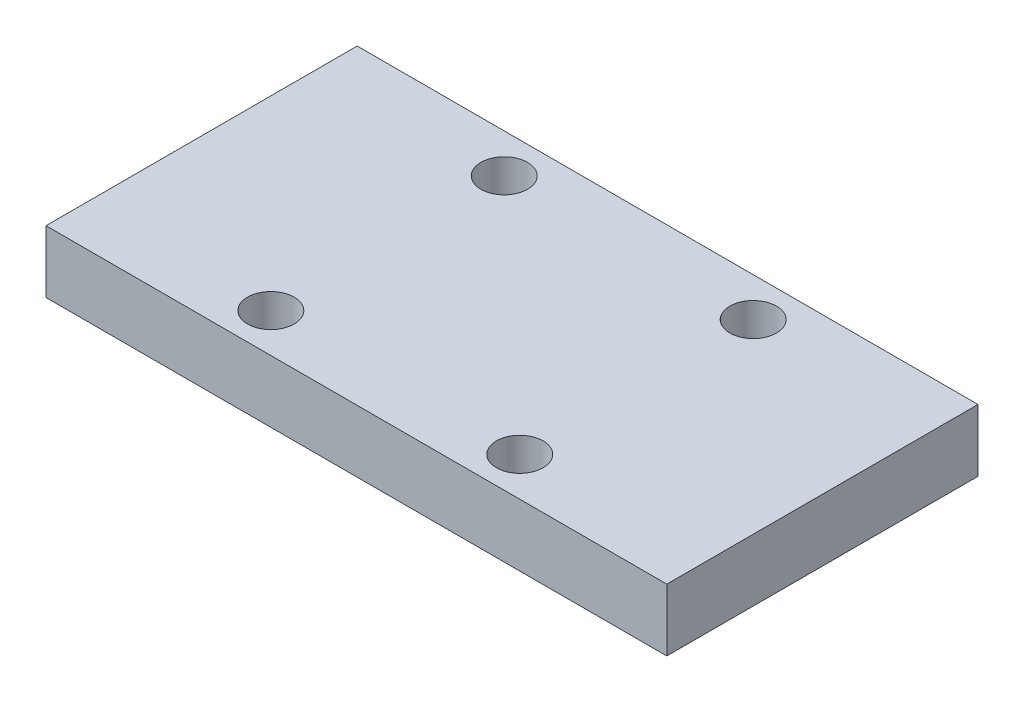
ISO-10303-21;
HEADER;
FILE_DESCRIPTION(('STEP AP214'),'2;1');
FILE_NAME('part.step','',(''),(''),'','','');
FILE_SCHEMA(('AUTOMOTIVE_DESIGN { 1 0 10303 214 1 1 1 1 }'));
ENDSEC;
DATA;
#1=APPLICATION_CONTEXT('core data for automotive mechanical design processes');
#2=APPLICATION_PROTOCOL_DEFINITION('international standard','automotive_design',2000,#1);
#3=PRODUCT_CONTEXT('',#1,'mechanical');
#4=PRODUCT('Part','Part','',(#3));
#5=PRODUCT_RELATED_PRODUCT_CATEGORY('part','',(#4));
#6=PRODUCT_DEFINITION_FORMATION('','',#4);
#7=PRODUCT_DEFINITION_CONTEXT('part definition',#1,'design');
#8=PRODUCT_DEFINITION('design','',#6,#7);
#9=PRODUCT_DEFINITION_SHAPE('','',#8);
#10=(LENGTH_UNIT() NAMED_UNIT(*) SI_UNIT(.MILLI.,.METRE.));
#11=(NAMED_UNIT(*) PLANE_ANGLE_UNIT() SI_UNIT($,.RADIAN.));
#12=(NAMED_UNIT(*) SI_UNIT($,.STERADIAN.) SOLID_ANGLE_UNIT());
#13=UNCERTAINTY_MEASURE_WITH_UNIT(LENGTH_MEASURE(1.E-05),#10,'distance_accuracy_value','');
#14=(GEOMETRIC_REPRESENTATION_CONTEXT(3) GLOBAL_UNCERTAINTY_ASSIGNED_CONTEXT((#13)) GLOBAL_UNIT_ASSIGNED_CONTEXT((#10,
#11,#12)) REPRESENTATION_CONTEXT('',''));
#15=CARTESIAN_POINT('',(0.,0.,0.));
#16=DIRECTION('',(0.,0.,1.));
#17=DIRECTION('',(1.,0.,0.));
#18=AXIS2_PLACEMENT_3D('',#15,#16,#17);
#19=CARTESIAN_POINT('',(0.,4.,0.));
#20=DIRECTION('',(0.,-1.,0.));
#21=DIRECTION('',(0.,0.,-1.));
#22=AXIS2_PLACEMENT_3D('',#19,#20,#21);
#23=PLANE('',#22);
#24=DIRECTION('',(0.,0.,-1.));
#25=VECTOR('',#24,1.);
#26=CARTESIAN_POINT('',(19.95,4.,10.));
#27=LINE('',#26,#25);
#28=CARTESIAN_POINT('',(19.95,4.,10.));
#29=VERTEX_POINT('',#28);
#30=CARTESIAN_POINT('',(19.95,4.,-10.));
#31=VERTEX_POINT('',#30);
#32=EDGE_CURVE('E96',#29,#31,#27,.T.);
#33=ORIENTED_EDGE('',*,*,#32,.T.);
#34=DIRECTION('',(-1.,0.,0.));
#35=VECTOR('',#34,1.);
#36=CARTESIAN_POINT('',(-19.95,4.,-10.));
#37=LINE('',#36,#35);
#38=CARTESIAN_POINT('',(-19.95,4.,-10.));
#39=VERTEX_POINT('',#38);
#40=EDGE_CURVE('E91',#31,#39,#37,.T.);
#41=ORIENTED_EDGE('',*,*,#40,.T.);
#42=DIRECTION('',(0.,0.,1.));
#43=VECTOR('',#42,1.);
#44=CARTESIAN_POINT('',(-19.95,4.,10.));
#45=LINE('',#44,#43);
#46=CARTESIAN_POINT('',(-19.95,4.,10.));
#47=VERTEX_POINT('',#46);
#48=EDGE_CURVE('E94',#39,#47,#45,.T.);
#49=ORIENTED_EDGE('',*,*,#48,.T.);
#50=DIRECTION('',(1.,0.,0.));
#51=VECTOR('',#50,1.);
#52=CARTESIAN_POINT('',(-19.95,4.,10.));
#53=LINE('',#52,#51);
#54=EDGE_CURVE('E61',#47,#29,#53,.T.);
#55=ORIENTED_EDGE('',*,*,#54,.T.);
#56=EDGE_LOOP('',(#33,#41,#49,#55));
#57=FACE_BOUND('',#56,.T.);
#58=CARTESIAN_POINT('',(8.,4.,-7.5));
#59=DIRECTION('',(0.,1.,0.));
#60=DIRECTION('',(0.,0.,1.));
#61=AXIS2_PLACEMENT_3D('',#58,#59,#60);
#62=CIRCLE('',#61,1.5);
#63=CARTESIAN_POINT('',(8.,4.,-6.));
#64=VERTEX_POINT('',#63);
#65=EDGE_CURVE('E116',#64,#64,#62,.T.);
#66=ORIENTED_EDGE('',*,*,#65,.F.);
#67=EDGE_LOOP('',(#66));
#68=FACE_BOUND('',#67,.T.);
#69=CARTESIAN_POINT('',(8.,4.,7.5));
#70=DIRECTION('',(0.,1.,0.));
#71=DIRECTION('',(0.,0.,-1.));
#72=AXIS2_PLACEMENT_3D('',#69,#70,#71);
#73=CIRCLE('',#72,1.5);
#74=CARTESIAN_POINT('',(8.,4.,6.));
#75=VERTEX_POINT('',#74);
#76=EDGE_CURVE('E138',#75,#75,#73,.T.);
#77=ORIENTED_EDGE('',*,*,#76,.F.);
#78=EDGE_LOOP('',(#77));
#79=FACE_BOUND('',#78,.T.);
#80=CARTESIAN_POINT('',(-8.,4.,7.5));
#81=DIRECTION('',(0.,1.,0.));
#82=DIRECTION('',(0.,0.,1.));
#83=AXIS2_PLACEMENT_3D('',#80,#81,#82);
#84=CIRCLE('',#83,1.5);
#85=CARTESIAN_POINT('',(-8.,4.,9.));
#86=VERTEX_POINT('',#85);
#87=EDGE_CURVE('E146',#86,#86,#84,.T.);
#88=ORIENTED_EDGE('',*,*,#87,.F.);
#89=EDGE_LOOP('',(#88));
#90=FACE_BOUND('',#89,.T.);
#91=CARTESIAN_POINT('',(-8.,4.,-7.5));
#92=DIRECTION('',(0.,1.,0.));
#93=DIRECTION('',(0.,0.,-1.));
#94=AXIS2_PLACEMENT_3D('',#91,#92,#93);
#95=CIRCLE('',#94,1.5);
#96=CARTESIAN_POINT('',(-8.,4.,-9.));
#97=VERTEX_POINT('',#96);
#98=EDGE_CURVE('E154',#97,#97,#95,.T.);
#99=ORIENTED_EDGE('',*,*,#98,.F.);
#100=EDGE_LOOP('',(#99));
#101=FACE_BOUND('',#100,.T.);
#102=ADVANCED_FACE('F43',(#57,#68,#79,#90,#101),#23,.F.);
#103=CARTESIAN_POINT('',(0.,0.,0.));
#104=DIRECTION('',(0.,-1.,0.));
#105=DIRECTION('',(0.,0.,-1.));
#106=AXIS2_PLACEMENT_3D('',#103,#104,#105);
#107=PLANE('',#106);
#108=CARTESIAN_POINT('',(-8.,0.,7.5));
#109=DIRECTION('',(0.,1.,0.));
#110=DIRECTION('',(0.,0.,1.));
#111=AXIS2_PLACEMENT_3D('',#108,#109,#110);
#112=CIRCLE('',#111,1.5);
#113=CARTESIAN_POINT('',(-8.,0.,9.));
#114=VERTEX_POINT('',#113);
#115=EDGE_CURVE('E150',#114,#114,#112,.T.);
#116=ORIENTED_EDGE('',*,*,#115,.T.);
#117=EDGE_LOOP('',(#116));
#118=FACE_BOUND('',#117,.T.);
#119=CARTESIAN_POINT('',(8.,0.,-7.5));
#120=DIRECTION('',(0.,1.,0.));
#121=DIRECTION('',(0.,0.,1.));
#122=AXIS2_PLACEMENT_3D('',#119,#120,#121);
#123=CIRCLE('',#122,1.5);
#124=CARTESIAN_POINT('',(8.,0.,-6.));
#125=VERTEX_POINT('',#124);
#126=EDGE_CURVE('E134',#125,#125,#123,.T.);
#127=ORIENTED_EDGE('',*,*,#126,.T.);
#128=EDGE_LOOP('',(#127));
#129=FACE_BOUND('',#128,.T.);
#130=DIRECTION('',(0.,0.,-1.));
#131=VECTOR('',#130,1.);
#132=CARTESIAN_POINT('',(19.95,0.,10.));
#133=LINE('',#132,#131);
#134=CARTESIAN_POINT('',(19.95,0.,10.));
#135=VERTEX_POINT('',#134);
#136=CARTESIAN_POINT('',(19.95,0.,-10.));
#137=VERTEX_POINT('',#136);
#138=EDGE_CURVE('E112',#135,#137,#133,.T.);
#139=ORIENTED_EDGE('',*,*,#138,.F.);
#140=DIRECTION('',(1.,0.,0.));
#141=VECTOR('',#140,1.);
#142=CARTESIAN_POINT('',(-19.95,0.,10.));
#143=LINE('',#142,#141);
#144=CARTESIAN_POINT('',(-19.95,0.,10.));
#145=VERTEX_POINT('',#144);
#146=EDGE_CURVE('E84',#145,#135,#143,.T.);
#147=ORIENTED_EDGE('',*,*,#146,.F.);
#148=DIRECTION('',(0.,0.,1.));
#149=VECTOR('',#148,1.);
#150=CARTESIAN_POINT('',(-19.95,0.,10.));
#151=LINE('',#150,#149);
#152=CARTESIAN_POINT('',(-19.95,0.,-10.));
#153=VERTEX_POINT('',#152);
#154=EDGE_CURVE('E78',#153,#145,#151,.T.);
#155=ORIENTED_EDGE('',*,*,#154,.F.);
#156=DIRECTION('',(-1.,0.,0.));
#157=VECTOR('',#156,1.);
#158=CARTESIAN_POINT('',(-19.95,0.,-10.));
#159=LINE('',#158,#157);
#160=EDGE_CURVE('E101',#137,#153,#159,.T.);
#161=ORIENTED_EDGE('',*,*,#160,.F.);
#162=EDGE_LOOP('',(#139,#147,#155,#161));
#163=FACE_BOUND('',#162,.T.);
#164=CARTESIAN_POINT('',(8.,0.,7.5));
#165=DIRECTION('',(0.,1.,0.));
#166=DIRECTION('',(0.,0.,-1.));
#167=AXIS2_PLACEMENT_3D('',#164,#165,#166);
#168=CIRCLE('',#167,1.5);
#169=CARTESIAN_POINT('',(8.,0.,6.));
#170=VERTEX_POINT('',#169);
#171=EDGE_CURVE('E142',#170,#170,#168,.T.);
#172=ORIENTED_EDGE('',*,*,#171,.T.);
#173=EDGE_LOOP('',(#172));
#174=FACE_BOUND('',#173,.T.);
#175=CARTESIAN_POINT('',(-8.,0.,-7.5));
#176=DIRECTION('',(0.,1.,0.));
#177=DIRECTION('',(0.,0.,-1.));
#178=AXIS2_PLACEMENT_3D('',#175,#176,#177);
#179=CIRCLE('',#178,1.5);
#180=CARTESIAN_POINT('',(-8.,0.,-9.));
#181=VERTEX_POINT('',#180);
#182=EDGE_CURVE('E158',#181,#181,#179,.T.);
#183=ORIENTED_EDGE('',*,*,#182,.T.);
#184=EDGE_LOOP('',(#183));
#185=FACE_BOUND('',#184,.T.);
#186=ADVANCED_FACE('F129',(#118,#129,#163,#174,#185),#107,.T.);
#187=CARTESIAN_POINT('',(19.95,4.,10.));
#188=DIRECTION('',(-1.,0.,0.));
#189=DIRECTION('',(0.,0.,1.));
#190=AXIS2_PLACEMENT_3D('',#187,#188,#189);
#191=PLANE('',#190);
#192=ORIENTED_EDGE('',*,*,#138,.T.);
#193=DIRECTION('',(0.,-1.,0.));
#194=VECTOR('',#193,1.);
#195=CARTESIAN_POINT('',(19.95,4.,-10.));
#196=LINE('',#195,#194);
#197=EDGE_CURVE('E11',#31,#137,#196,.T.);
#198=ORIENTED_EDGE('',*,*,#197,.F.);
#199=ORIENTED_EDGE('',*,*,#32,.F.);
#200=DIRECTION('',(0.,-1.,0.));
#201=VECTOR('',#200,1.);
#202=CARTESIAN_POINT('',(19.95,4.,10.));
#203=LINE('',#202,#201);
#204=EDGE_CURVE('E108',#29,#135,#203,.T.);
#205=ORIENTED_EDGE('',*,*,#204,.T.);
#206=EDGE_LOOP('',(#192,#198,#199,#205));
#207=FACE_BOUND('',#206,.T.);
#208=ADVANCED_FACE('F45',(#207),#191,.F.);
#209=CARTESIAN_POINT('',(-19.95,4.,-10.));
#210=DIRECTION('',(0.,0.,1.));
#211=DIRECTION('',(1.,0.,0.));
#212=AXIS2_PLACEMENT_3D('',#209,#210,#211);
#213=PLANE('',#212);
#214=ORIENTED_EDGE('',*,*,#160,.T.);
#215=DIRECTION('',(0.,-1.,0.));
#216=VECTOR('',#215,1.);
#217=CARTESIAN_POINT('',(-19.95,4.,-10.));
#218=LINE('',#217,#216);
#219=EDGE_CURVE('E53',#39,#153,#218,.T.);
#220=ORIENTED_EDGE('',*,*,#219,.F.);
#221=ORIENTED_EDGE('',*,*,#40,.F.);
#222=ORIENTED_EDGE('',*,*,#197,.T.);
#223=EDGE_LOOP('',(#214,#220,#221,#222));
#224=FACE_BOUND('',#223,.T.);
#225=ADVANCED_FACE('F100',(#224),#213,.F.);
#226=CARTESIAN_POINT('',(-19.95,4.,10.));
#227=DIRECTION('',(1.,0.,0.));
#228=DIRECTION('',(0.,0.,-1.));
#229=AXIS2_PLACEMENT_3D('',#226,#227,#228);
#230=PLANE('',#229);
#231=ORIENTED_EDGE('',*,*,#154,.T.);
#232=DIRECTION('',(0.,-1.,0.));
#233=VECTOR('',#232,1.);
#234=CARTESIAN_POINT('',(-19.95,4.,10.));
#235=LINE('',#234,#233);
#236=EDGE_CURVE('E103',#47,#145,#235,.T.);
#237=ORIENTED_EDGE('',*,*,#236,.F.);
#238=ORIENTED_EDGE('',*,*,#48,.F.);
#239=ORIENTED_EDGE('',*,*,#219,.T.);
#240=EDGE_LOOP('',(#231,#237,#238,#239));
#241=FACE_BOUND('',#240,.T.);
#242=ADVANCED_FACE('F104',(#241),#230,.F.);
#243=CARTESIAN_POINT('',(-19.95,4.,10.));
#244=DIRECTION('',(0.,0.,-1.));
#245=DIRECTION('',(-1.,0.,0.));
#246=AXIS2_PLACEMENT_3D('',#243,#244,#245);
#247=PLANE('',#246);
#248=ORIENTED_EDGE('',*,*,#146,.T.);
#249=ORIENTED_EDGE('',*,*,#204,.F.);
#250=ORIENTED_EDGE('',*,*,#54,.F.);
#251=ORIENTED_EDGE('',*,*,#236,.T.);
#252=EDGE_LOOP('',(#248,#249,#250,#251));
#253=FACE_BOUND('',#252,.T.);
#254=ADVANCED_FACE('F126',(#253),#247,.F.);
#255=CARTESIAN_POINT('',(8.,4.,-7.5));
#256=DIRECTION('',(0.,-1.,0.));
#257=DIRECTION('',(0.,0.,-1.));
#258=AXIS2_PLACEMENT_3D('',#255,#256,#257);
#259=CYLINDRICAL_SURFACE('',#258,1.5);
#260=ORIENTED_EDGE('',*,*,#65,.T.);
#261=EDGE_LOOP('',(#260));
#262=FACE_BOUND('',#261,.T.);
#263=ORIENTED_EDGE('',*,*,#126,.F.);
#264=EDGE_LOOP('',(#263));
#265=FACE_BOUND('',#264,.T.);
#266=ADVANCED_FACE('F177',(#262,#265),#259,.F.);
#267=CARTESIAN_POINT('',(8.,4.,7.5));
#268=DIRECTION('',(0.,-1.,0.));
#269=DIRECTION('',(0.,0.,-1.));
#270=AXIS2_PLACEMENT_3D('',#267,#268,#269);
#271=CYLINDRICAL_SURFACE('',#270,1.5);
#272=ORIENTED_EDGE('',*,*,#76,.T.);
#273=EDGE_LOOP('',(#272));
#274=FACE_BOUND('',#273,.T.);
#275=ORIENTED_EDGE('',*,*,#171,.F.);
#276=EDGE_LOOP('',(#275));
#277=FACE_BOUND('',#276,.T.);
#278=ADVANCED_FACE('F231',(#274,#277),#271,.F.);
#279=CARTESIAN_POINT('',(-8.,4.,7.5));
#280=DIRECTION('',(0.,-1.,0.));
#281=DIRECTION('',(0.,0.,-1.));
#282=AXIS2_PLACEMENT_3D('',#279,#280,#281);
#283=CYLINDRICAL_SURFACE('',#282,1.5);
#284=ORIENTED_EDGE('',*,*,#87,.T.);
#285=EDGE_LOOP('',(#284));
#286=FACE_BOUND('',#285,.T.);
#287=ORIENTED_EDGE('',*,*,#115,.F.);
#288=EDGE_LOOP('',(#287));
#289=FACE_BOUND('',#288,.T.);
#290=ADVANCED_FACE('F240',(#286,#289),#283,.F.);
#291=CARTESIAN_POINT('',(-8.,4.,-7.5));
#292=DIRECTION('',(0.,-1.,0.));
#293=DIRECTION('',(0.,0.,-1.));
#294=AXIS2_PLACEMENT_3D('',#291,#292,#293);
#295=CYLINDRICAL_SURFACE('',#294,1.5);
#296=ORIENTED_EDGE('',*,*,#98,.T.);
#297=EDGE_LOOP('',(#296));
#298=FACE_BOUND('',#297,.T.);
#299=ORIENTED_EDGE('',*,*,#182,.F.);
#300=EDGE_LOOP('',(#299));
#301=FACE_BOUND('',#300,.T.);
#302=ADVANCED_FACE('F166',(#298,#301),#295,.F.);
#303=CLOSED_SHELL('',(#102,#186,#208,#225,#242,#254,#266,#278,#290,#302));
#304=MANIFOLD_SOLID_BREP('B2',#303);
#305=ADVANCED_BREP_SHAPE_REPRESENTATION('',(#18,#304),#14);
#306=SHAPE_DEFINITION_REPRESENTATION(#9,#305);
ENDSEC;
END-ISO-10303-21;
